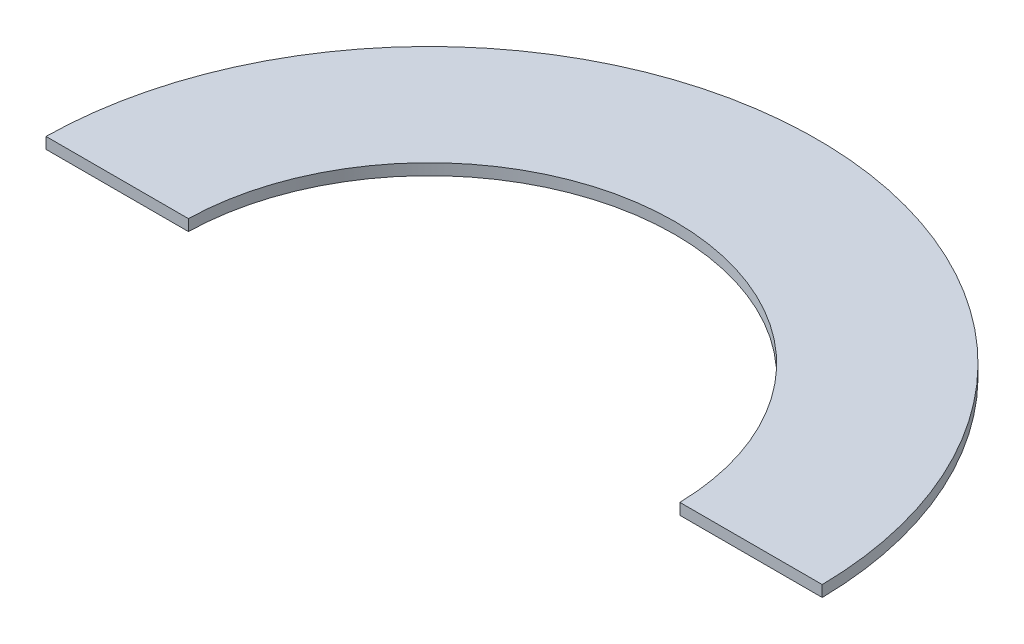
ISO-10303-21;
HEADER;
FILE_DESCRIPTION(('STEP AP214'),'2;1');
FILE_NAME('part.step','',(''),(''),'','','');
FILE_SCHEMA(('AUTOMOTIVE_DESIGN { 1 0 10303 214 1 1 1 1 }'));
ENDSEC;
DATA;
#1=APPLICATION_CONTEXT('core data for automotive mechanical design processes');
#2=APPLICATION_PROTOCOL_DEFINITION('international standard','automotive_design',2000,#1);
#3=PRODUCT_CONTEXT('',#1,'mechanical');
#4=PRODUCT('Part','Part','',(#3));
#5=PRODUCT_RELATED_PRODUCT_CATEGORY('part','',(#4));
#6=PRODUCT_DEFINITION_FORMATION('','',#4);
#7=PRODUCT_DEFINITION_CONTEXT('part definition',#1,'design');
#8=PRODUCT_DEFINITION('design','',#6,#7);
#9=PRODUCT_DEFINITION_SHAPE('','',#8);
#10=(LENGTH_UNIT() NAMED_UNIT(*) SI_UNIT(.MILLI.,.METRE.));
#11=(NAMED_UNIT(*) PLANE_ANGLE_UNIT() SI_UNIT($,.RADIAN.));
#12=(NAMED_UNIT(*) SI_UNIT($,.STERADIAN.) SOLID_ANGLE_UNIT());
#13=UNCERTAINTY_MEASURE_WITH_UNIT(LENGTH_MEASURE(1.E-05),#10,'distance_accuracy_value','');
#14=(GEOMETRIC_REPRESENTATION_CONTEXT(3) GLOBAL_UNCERTAINTY_ASSIGNED_CONTEXT((#13)) GLOBAL_UNIT_ASSIGNED_CONTEXT((#10,
#11,#12)) REPRESENTATION_CONTEXT('',''));
#15=CARTESIAN_POINT('',(0.,0.,0.));
#16=DIRECTION('',(0.,0.,1.));
#17=DIRECTION('',(1.,0.,0.));
#18=AXIS2_PLACEMENT_3D('',#15,#16,#17);
#19=CARTESIAN_POINT('',(-9.07999999999982,-34.3699379173652,36.2199999999995));
#20=DIRECTION('',(0.,-1.,0.));
#21=DIRECTION('',(1.,0.,0.));
#22=AXIS2_PLACEMENT_3D('',#19,#20,#21);
#23=CYLINDRICAL_SURFACE('',#22,2.76383750507377);
#24=CARTESIAN_POINT('',(-9.07999999999982,-34.3699379173652,36.2199999999995));
#25=DIRECTION('',(0.,1.,0.));
#26=DIRECTION('',(1.,0.,0.));
#27=AXIS2_PLACEMENT_3D('',#24,#25,#26);
#28=CIRCLE('',#27,2.76383750507377);
#29=CARTESIAN_POINT('',(-6.31639486556329,-34.3699379173652,36.1841612588325));
#30=VERTEX_POINT('',#29);
#31=CARTESIAN_POINT('',(-11.8436051344364,-34.3699379173652,36.1841612588325));
#32=VERTEX_POINT('',#31);
#33=EDGE_CURVE('E97',#30,#32,#28,.T.);
#34=ORIENTED_EDGE('',*,*,#33,.T.);
#35=DIRECTION('',(0.,1.,0.));
#36=VECTOR('',#35,1.);
#37=CARTESIAN_POINT('',(-11.8436051344364,-34.3699379173652,36.1841612588325));
#38=LINE('',#37,#36);
#39=CARTESIAN_POINT('',(-11.8436051344364,-34.2899379173652,36.1841612588325));
#40=VERTEX_POINT('',#39);
#41=EDGE_CURVE('E11',#32,#40,#38,.T.);
#42=ORIENTED_EDGE('',*,*,#41,.T.);
#43=CARTESIAN_POINT('',(-9.07999999999982,-34.2899379173652,36.2199999999995));
#44=DIRECTION('',(0.,-1.,0.));
#45=DIRECTION('',(1.,0.,0.));
#46=AXIS2_PLACEMENT_3D('',#43,#44,#45);
#47=CIRCLE('',#46,2.76383750507377);
#48=CARTESIAN_POINT('',(-6.31639486556329,-34.2899379173652,36.1841612588325));
#49=VERTEX_POINT('',#48);
#50=EDGE_CURVE('E20',#40,#49,#47,.T.);
#51=ORIENTED_EDGE('',*,*,#50,.T.);
#52=DIRECTION('',(0.,-1.,0.));
#53=VECTOR('',#52,1.);
#54=CARTESIAN_POINT('',(-6.31639486556329,-34.3699379173652,36.1841612588325));
#55=LINE('',#54,#53);
#56=EDGE_CURVE('E90',#49,#30,#55,.T.);
#57=ORIENTED_EDGE('',*,*,#56,.T.);
#58=EDGE_LOOP('',(#34,#42,#51,#57));
#59=FACE_BOUND('',#58,.T.);
#60=ADVANCED_FACE('F16',(#59),#23,.T.);
#61=CARTESIAN_POINT('',(-19.5722767349702,-34.3699379173652,36.1841612588325));
#62=DIRECTION('',(0.,0.,1.));
#63=DIRECTION('',(1.,0.,0.));
#64=AXIS2_PLACEMENT_3D('',#61,#62,#63);
#65=PLANE('',#64);
#66=ORIENTED_EDGE('',*,*,#41,.F.);
#67=DIRECTION('',(1.,0.,0.));
#68=VECTOR('',#67,1.);
#69=CARTESIAN_POINT('',(-19.5722767349702,-34.3699379173652,36.1841612588325));
#70=LINE('',#69,#68);
#71=CARTESIAN_POINT('',(-10.8296329856947,-34.3699379173652,36.1841612588325));
#72=VERTEX_POINT('',#71);
#73=EDGE_CURVE('E27',#32,#72,#70,.T.);
#74=ORIENTED_EDGE('',*,*,#73,.T.);
#75=DIRECTION('',(0.,1.,0.));
#76=VECTOR('',#75,1.);
#77=CARTESIAN_POINT('',(-10.8296329856947,-34.3699379173652,36.1841612588325));
#78=LINE('',#77,#76);
#79=CARTESIAN_POINT('',(-10.8296329856947,-34.2899379173652,36.1841612588325));
#80=VERTEX_POINT('',#79);
#81=EDGE_CURVE('E101',#72,#80,#78,.T.);
#82=ORIENTED_EDGE('',*,*,#81,.T.);
#83=DIRECTION('',(1.,0.,0.));
#84=VECTOR('',#83,1.);
#85=CARTESIAN_POINT('',(-19.5722767349702,-34.2899379173652,36.1841612588325));
#86=LINE('',#85,#84);
#87=EDGE_CURVE('E72',#40,#80,#86,.T.);
#88=ORIENTED_EDGE('',*,*,#87,.F.);
#89=EDGE_LOOP('',(#66,#74,#82,#88));
#90=FACE_BOUND('',#89,.T.);
#91=ADVANCED_FACE('F140',(#90),#65,.T.);
#92=CARTESIAN_POINT('',(59.5028232650299,-34.3699379173652,-0.315788741167555));
#93=DIRECTION('',(0.,1.,0.));
#94=DIRECTION('',(0.,0.,-1.));
#95=AXIS2_PLACEMENT_3D('',#92,#93,#94);
#96=PLANE('',#95);
#97=ORIENTED_EDGE('',*,*,#33,.F.);
#98=DIRECTION('',(1.,0.,0.));
#99=VECTOR('',#98,1.);
#100=CARTESIAN_POINT('',(-19.5722767349702,-34.3699379173652,36.1841612588325));
#101=LINE('',#100,#99);
#102=CARTESIAN_POINT('',(-7.33036701430494,-34.3699379173652,36.1841612588325));
#103=VERTEX_POINT('',#102);
#104=EDGE_CURVE('E86',#103,#30,#101,.T.);
#105=ORIENTED_EDGE('',*,*,#104,.F.);
#106=CARTESIAN_POINT('',(-9.07999999999982,-34.3699379173652,36.2199999999995));
#107=DIRECTION('',(0.,1.,0.));
#108=DIRECTION('',(1.,0.,0.));
#109=AXIS2_PLACEMENT_3D('',#106,#107,#108);
#110=CIRCLE('',#109,1.75);
#111=EDGE_CURVE('E76',#103,#72,#110,.T.);
#112=ORIENTED_EDGE('',*,*,#111,.T.);
#113=ORIENTED_EDGE('',*,*,#73,.F.);
#114=EDGE_LOOP('',(#97,#105,#112,#113));
#115=FACE_BOUND('',#114,.T.);
#116=ADVANCED_FACE('F18',(#115),#96,.F.);
#117=CARTESIAN_POINT('',(-9.07999999999982,-34.3699379173652,36.2199999999995));
#118=DIRECTION('',(0.,1.,0.));
#119=DIRECTION('',(1.,0.,0.));
#120=AXIS2_PLACEMENT_3D('',#117,#118,#119);
#121=CYLINDRICAL_SURFACE('',#120,1.75);
#122=ORIENTED_EDGE('',*,*,#111,.F.);
#123=DIRECTION('',(0.,-1.,0.));
#124=VECTOR('',#123,1.);
#125=CARTESIAN_POINT('',(-7.33036701430494,-34.3699379173652,36.1841612588325));
#126=LINE('',#125,#124);
#127=CARTESIAN_POINT('',(-7.33036701430494,-34.2899379173652,36.1841612588325));
#128=VERTEX_POINT('',#127);
#129=EDGE_CURVE('E79',#128,#103,#126,.T.);
#130=ORIENTED_EDGE('',*,*,#129,.F.);
#131=CARTESIAN_POINT('',(-9.07999999999982,-34.2899379173652,36.2199999999995));
#132=DIRECTION('',(0.,-1.,0.));
#133=DIRECTION('',(1.,0.,0.));
#134=AXIS2_PLACEMENT_3D('',#131,#132,#133);
#135=CIRCLE('',#134,1.75);
#136=EDGE_CURVE('E65',#80,#128,#135,.T.);
#137=ORIENTED_EDGE('',*,*,#136,.F.);
#138=ORIENTED_EDGE('',*,*,#81,.F.);
#139=EDGE_LOOP('',(#122,#130,#137,#138));
#140=FACE_BOUND('',#139,.T.);
#141=ADVANCED_FACE('F80',(#140),#121,.F.);
#142=CARTESIAN_POINT('',(59.5028232650299,-34.2899379173652,-0.315788741167555));
#143=DIRECTION('',(0.,1.,0.));
#144=DIRECTION('',(0.,0.,-1.));
#145=AXIS2_PLACEMENT_3D('',#142,#143,#144);
#146=PLANE('',#145);
#147=ORIENTED_EDGE('',*,*,#50,.F.);
#148=ORIENTED_EDGE('',*,*,#87,.T.);
#149=ORIENTED_EDGE('',*,*,#136,.T.);
#150=DIRECTION('',(1.,0.,0.));
#151=VECTOR('',#150,1.);
#152=CARTESIAN_POINT('',(-19.5722767349702,-34.2899379173652,36.1841612588325));
#153=LINE('',#152,#151);
#154=EDGE_CURVE('E70',#128,#49,#153,.T.);
#155=ORIENTED_EDGE('',*,*,#154,.T.);
#156=EDGE_LOOP('',(#147,#148,#149,#155));
#157=FACE_BOUND('',#156,.T.);
#158=ADVANCED_FACE('F68',(#157),#146,.T.);
#159=CARTESIAN_POINT('',(-19.5722767349702,-34.3699379173652,36.1841612588325));
#160=DIRECTION('',(0.,0.,1.));
#161=DIRECTION('',(1.,0.,0.));
#162=AXIS2_PLACEMENT_3D('',#159,#160,#161);
#163=PLANE('',#162);
#164=ORIENTED_EDGE('',*,*,#56,.F.);
#165=ORIENTED_EDGE('',*,*,#154,.F.);
#166=ORIENTED_EDGE('',*,*,#129,.T.);
#167=ORIENTED_EDGE('',*,*,#104,.T.);
#168=EDGE_LOOP('',(#164,#165,#166,#167));
#169=FACE_BOUND('',#168,.T.);
#170=ADVANCED_FACE('F88',(#169),#163,.T.);
#171=CLOSED_SHELL('',(#60,#91,#116,#141,#158,#170));
#172=MANIFOLD_SOLID_BREP('B1',#171);
#173=ADVANCED_BREP_SHAPE_REPRESENTATION('',(#18,#172),#14);
#174=SHAPE_DEFINITION_REPRESENTATION(#9,#173);
ENDSEC;
END-ISO-10303-21;
